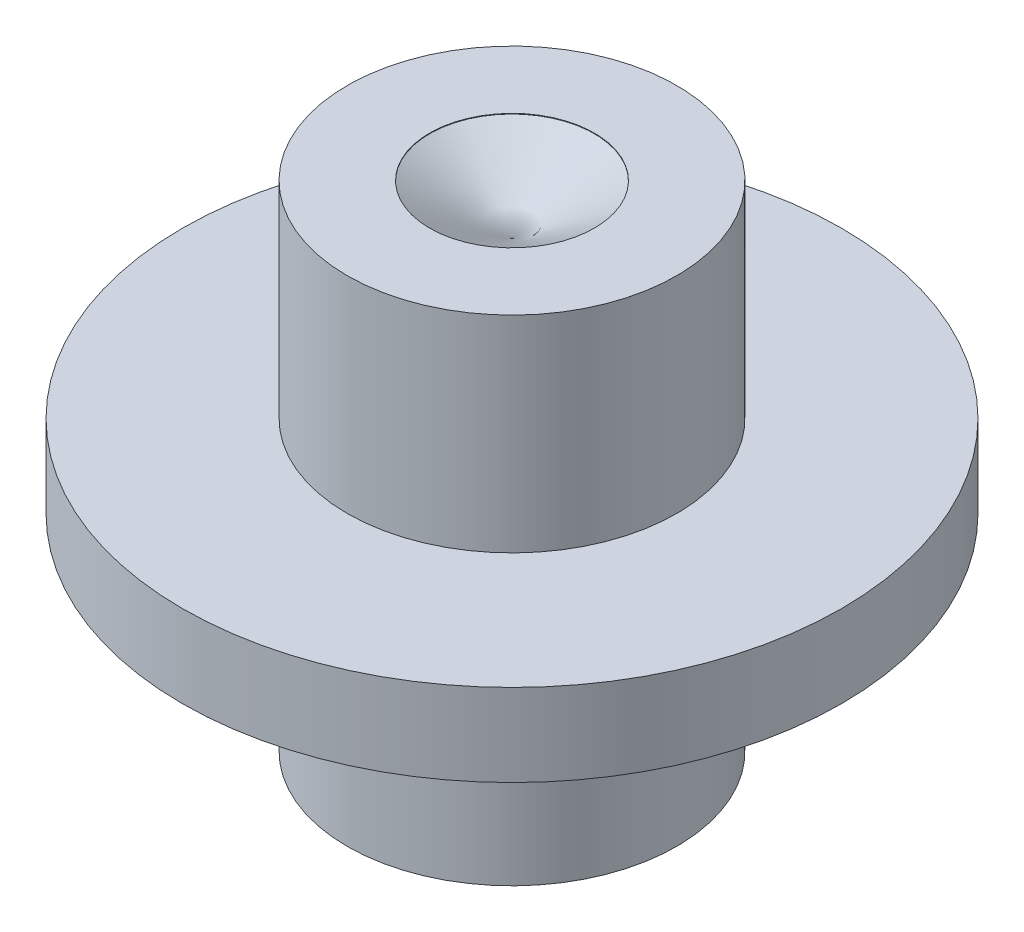
ISO-10303-21;
HEADER;
FILE_DESCRIPTION(('STEP AP214'),'2;1');
FILE_NAME('part.step','',(''),(''),'','','');
FILE_SCHEMA(('AUTOMOTIVE_DESIGN { 1 0 10303 214 1 1 1 1 }'));
ENDSEC;
DATA;
#1=APPLICATION_CONTEXT('core data for automotive mechanical design processes');
#2=APPLICATION_PROTOCOL_DEFINITION('international standard','automotive_design',2000,#1);
#3=PRODUCT_CONTEXT('',#1,'mechanical');
#4=PRODUCT('Part','Part','',(#3));
#5=PRODUCT_RELATED_PRODUCT_CATEGORY('part','',(#4));
#6=PRODUCT_DEFINITION_FORMATION('','',#4);
#7=PRODUCT_DEFINITION_CONTEXT('part definition',#1,'design');
#8=PRODUCT_DEFINITION('design','',#6,#7);
#9=PRODUCT_DEFINITION_SHAPE('','',#8);
#10=(LENGTH_UNIT() NAMED_UNIT(*) SI_UNIT(.MILLI.,.METRE.));
#11=(NAMED_UNIT(*) PLANE_ANGLE_UNIT() SI_UNIT($,.RADIAN.));
#12=(NAMED_UNIT(*) SI_UNIT($,.STERADIAN.) SOLID_ANGLE_UNIT());
#13=UNCERTAINTY_MEASURE_WITH_UNIT(LENGTH_MEASURE(1.E-05),#10,'distance_accuracy_value','');
#14=(GEOMETRIC_REPRESENTATION_CONTEXT(3) GLOBAL_UNCERTAINTY_ASSIGNED_CONTEXT((#13)) GLOBAL_UNIT_ASSIGNED_CONTEXT((#10,
#11,#12)) REPRESENTATION_CONTEXT('',''));
#15=CARTESIAN_POINT('',(0.,0.,0.));
#16=DIRECTION('',(0.,0.,1.));
#17=DIRECTION('',(1.,0.,0.));
#18=AXIS2_PLACEMENT_3D('',#15,#16,#17);
#19=CARTESIAN_POINT('',(0.,4.7625,0.));
#20=DIRECTION('',(0.,-1.,0.));
#21=DIRECTION('',(0.,0.,-1.));
#22=AXIS2_PLACEMENT_3D('',#19,#20,#21);
#23=PLANE('',#22);
#24=CARTESIAN_POINT('',(0.,4.7625,0.));
#25=DIRECTION('',(0.,1.,0.));
#26=DIRECTION('',(0.,0.,1.));
#27=AXIS2_PLACEMENT_3D('',#24,#25,#26);
#28=CIRCLE('',#27,1.58749999999999);
#29=CARTESIAN_POINT('',(0.,4.7625,1.58749999999999));
#30=VERTEX_POINT('',#29);
#31=EDGE_CURVE('E62',#30,#30,#28,.T.);
#32=ORIENTED_EDGE('',*,*,#31,.F.);
#33=EDGE_LOOP('',(#32));
#34=FACE_BOUND('',#33,.T.);
#35=CARTESIAN_POINT('',(0.,4.7625,0.));
#36=DIRECTION('',(0.,1.,0.));
#37=DIRECTION('',(0.,0.,1.));
#38=AXIS2_PLACEMENT_3D('',#35,#36,#37);
#39=CIRCLE('',#38,3.175);
#40=CARTESIAN_POINT('',(0.,4.7625,3.175));
#41=VERTEX_POINT('',#40);
#42=EDGE_CURVE('E11',#41,#41,#39,.T.);
#43=ORIENTED_EDGE('',*,*,#42,.T.);
#44=EDGE_LOOP('',(#43));
#45=FACE_BOUND('',#44,.T.);
#46=ADVANCED_FACE('F39',(#34,#45),#23,.F.);
#47=CARTESIAN_POINT('',(0.,4.7625,0.));
#48=DIRECTION('',(0.,1.,0.));
#49=DIRECTION('',(0.,0.,1.));
#50=AXIS2_PLACEMENT_3D('',#47,#48,#49);
#51=CYLINDRICAL_SURFACE('',#50,3.175);
#52=ORIENTED_EDGE('',*,*,#42,.F.);
#53=EDGE_LOOP('',(#52));
#54=FACE_BOUND('',#53,.T.);
#55=CARTESIAN_POINT('',(0.,0.79375,0.));
#56=DIRECTION('',(0.,1.,0.));
#57=DIRECTION('',(0.,0.,1.));
#58=AXIS2_PLACEMENT_3D('',#55,#56,#57);
#59=CIRCLE('',#58,3.175);
#60=CARTESIAN_POINT('',(0.,0.79375,3.175));
#61=VERTEX_POINT('',#60);
#62=EDGE_CURVE('E46',#61,#61,#59,.T.);
#63=ORIENTED_EDGE('',*,*,#62,.T.);
#64=EDGE_LOOP('',(#63));
#65=FACE_BOUND('',#64,.T.);
#66=ADVANCED_FACE('F86',(#54,#65),#51,.T.);
#67=CARTESIAN_POINT('',(3.175,0.79375,0.));
#68=DIRECTION('',(0.,-1.,0.));
#69=DIRECTION('',(0.,0.,-1.));
#70=AXIS2_PLACEMENT_3D('',#67,#68,#69);
#71=PLANE('',#70);
#72=ORIENTED_EDGE('',*,*,#62,.F.);
#73=EDGE_LOOP('',(#72));
#74=FACE_BOUND('',#73,.T.);
#75=CARTESIAN_POINT('',(0.,0.79375,0.));
#76=DIRECTION('',(0.,1.,0.));
#77=DIRECTION('',(0.,0.,1.));
#78=AXIS2_PLACEMENT_3D('',#75,#76,#77);
#79=CIRCLE('',#78,6.35);
#80=CARTESIAN_POINT('',(0.,0.79375,6.35));
#81=VERTEX_POINT('',#80);
#82=EDGE_CURVE('E79',#81,#81,#79,.T.);
#83=ORIENTED_EDGE('',*,*,#82,.T.);
#84=EDGE_LOOP('',(#83));
#85=FACE_BOUND('',#84,.T.);
#86=ADVANCED_FACE('F88',(#74,#85),#71,.F.);
#87=CARTESIAN_POINT('',(0.,4.7625,0.));
#88=DIRECTION('',(0.,1.,0.));
#89=DIRECTION('',(0.,0.,1.));
#90=AXIS2_PLACEMENT_3D('',#87,#88,#89);
#91=CYLINDRICAL_SURFACE('',#90,6.35);
#92=ORIENTED_EDGE('',*,*,#82,.F.);
#93=EDGE_LOOP('',(#92));
#94=FACE_BOUND('',#93,.T.);
#95=CARTESIAN_POINT('',(0.,-0.79375,0.));
#96=DIRECTION('',(0.,1.,0.));
#97=DIRECTION('',(0.,0.,1.));
#98=AXIS2_PLACEMENT_3D('',#95,#96,#97);
#99=CIRCLE('',#98,6.35);
#100=CARTESIAN_POINT('',(0.,-0.79375,6.35));
#101=VERTEX_POINT('',#100);
#102=EDGE_CURVE('E75',#101,#101,#99,.T.);
#103=ORIENTED_EDGE('',*,*,#102,.T.);
#104=EDGE_LOOP('',(#103));
#105=FACE_BOUND('',#104,.T.);
#106=ADVANCED_FACE('F91',(#94,#105),#91,.T.);
#107=CARTESIAN_POINT('',(6.35,-0.79375,0.));
#108=DIRECTION('',(0.,1.,0.));
#109=DIRECTION('',(0.,0.,1.));
#110=AXIS2_PLACEMENT_3D('',#107,#108,#109);
#111=PLANE('',#110);
#112=ORIENTED_EDGE('',*,*,#102,.F.);
#113=EDGE_LOOP('',(#112));
#114=FACE_BOUND('',#113,.T.);
#115=CARTESIAN_POINT('',(0.,-0.79375,0.));
#116=DIRECTION('',(0.,1.,0.));
#117=DIRECTION('',(0.,0.,1.));
#118=AXIS2_PLACEMENT_3D('',#115,#116,#117);
#119=CIRCLE('',#118,3.175);
#120=CARTESIAN_POINT('',(0.,-0.79375,3.175));
#121=VERTEX_POINT('',#120);
#122=EDGE_CURVE('E68',#121,#121,#119,.T.);
#123=ORIENTED_EDGE('',*,*,#122,.T.);
#124=EDGE_LOOP('',(#123));
#125=FACE_BOUND('',#124,.T.);
#126=ADVANCED_FACE('F97',(#114,#125),#111,.F.);
#127=CARTESIAN_POINT('',(0.,4.7625,0.));
#128=DIRECTION('',(0.,1.,0.));
#129=DIRECTION('',(0.,0.,1.));
#130=AXIS2_PLACEMENT_3D('',#127,#128,#129);
#131=CYLINDRICAL_SURFACE('',#130,3.175);
#132=ORIENTED_EDGE('',*,*,#122,.F.);
#133=EDGE_LOOP('',(#132));
#134=FACE_BOUND('',#133,.T.);
#135=CARTESIAN_POINT('',(0.,-4.7625,0.));
#136=DIRECTION('',(0.,1.,0.));
#137=DIRECTION('',(0.,0.,1.));
#138=AXIS2_PLACEMENT_3D('',#135,#136,#137);
#139=CIRCLE('',#138,3.175);
#140=CARTESIAN_POINT('',(0.,-4.7625,3.175));
#141=VERTEX_POINT('',#140);
#142=EDGE_CURVE('E61',#141,#141,#139,.T.);
#143=ORIENTED_EDGE('',*,*,#142,.T.);
#144=EDGE_LOOP('',(#143));
#145=FACE_BOUND('',#144,.T.);
#146=ADVANCED_FACE('F103',(#134,#145),#131,.T.);
#147=CARTESIAN_POINT('',(3.175,-4.7625,0.));
#148=DIRECTION('',(0.,1.,0.));
#149=DIRECTION('',(0.,0.,1.));
#150=AXIS2_PLACEMENT_3D('',#147,#148,#149);
#151=PLANE('',#150);
#152=ORIENTED_EDGE('',*,*,#142,.F.);
#153=EDGE_LOOP('',(#152));
#154=FACE_BOUND('',#153,.T.);
#155=ADVANCED_FACE('F54',(#154),#151,.F.);
#156=CARTESIAN_POINT('',(0.,4.75116623270625,0.));
#157=DIRECTION('',(0.,1.,0.));
#158=DIRECTION('',(0.,0.,1.));
#159=AXIS2_PLACEMENT_3D('',#156,#157,#158);
#160=CONICAL_SURFACE('',#159,1.5875,1.02974425867665);
#161=CARTESIAN_POINT('',(0.,3.7973,0.));
#162=VERTEX_POINT('',#161);
#163=VERTEX_LOOP('',#162);
#164=FACE_BOUND('',#163,.T.);
#165=CARTESIAN_POINT('',(0.,4.75116623270625,0.));
#166=DIRECTION('',(0.,1.,0.));
#167=DIRECTION('',(0.,0.,1.));
#168=AXIS2_PLACEMENT_3D('',#165,#166,#167);
#169=CIRCLE('',#168,1.5875);
#170=CARTESIAN_POINT('',(0.,4.75116623270625,1.5875));
#171=VERTEX_POINT('',#170);
#172=EDGE_CURVE('E58',#171,#171,#169,.T.);
#173=ORIENTED_EDGE('',*,*,#172,.T.);
#174=EDGE_LOOP('',(#173));
#175=FACE_BOUND('',#174,.T.);
#176=ADVANCED_FACE('F50',(#164,#175),#160,.F.);
#177=CARTESIAN_POINT('',(0.,4.7625,0.));
#178=DIRECTION('',(0.,1.,0.));
#179=DIRECTION('',(0.,0.,1.));
#180=AXIS2_PLACEMENT_3D('',#177,#178,#179);
#181=CYLINDRICAL_SURFACE('',#180,1.5875);
#182=ORIENTED_EDGE('',*,*,#172,.F.);
#183=EDGE_LOOP('',(#182));
#184=FACE_BOUND('',#183,.T.);
#185=ORIENTED_EDGE('',*,*,#31,.T.);
#186=EDGE_LOOP('',(#185));
#187=FACE_BOUND('',#186,.T.);
#188=ADVANCED_FACE('F53',(#184,#187),#181,.F.);
#189=CLOSED_SHELL('',(#46,#66,#86,#106,#126,#146,#155,#176,#188));
#190=MANIFOLD_SOLID_BREP('B2',#189);
#191=ADVANCED_BREP_SHAPE_REPRESENTATION('',(#18,#190),#14);
#192=SHAPE_DEFINITION_REPRESENTATION(#9,#191);
ENDSEC;
END-ISO-10303-21;
